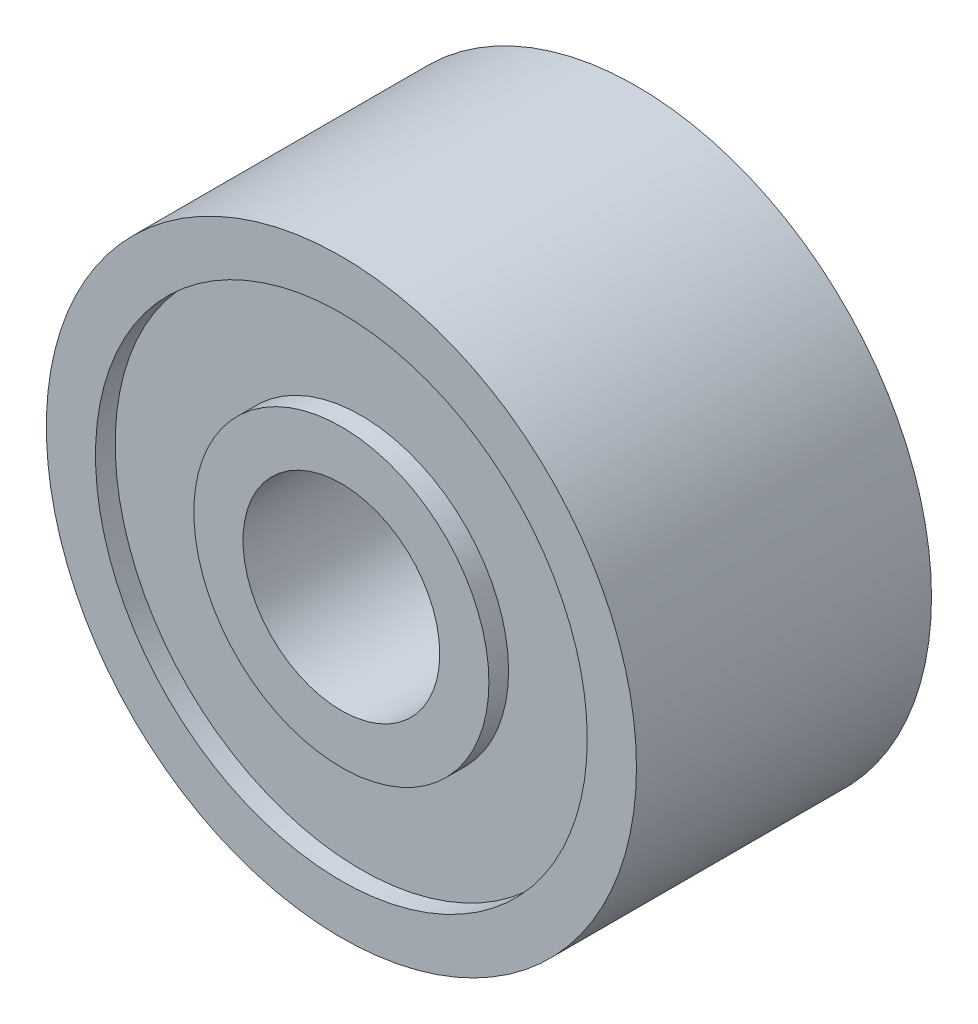
ISO-10303-21;
HEADER;
FILE_DESCRIPTION(('STEP AP214'),'2;1');
FILE_NAME('part.step','',(''),(''),'','','');
FILE_SCHEMA(('AUTOMOTIVE_DESIGN { 1 0 10303 214 1 1 1 1 }'));
ENDSEC;
DATA;
#1=APPLICATION_CONTEXT('core data for automotive mechanical design processes');
#2=APPLICATION_PROTOCOL_DEFINITION('international standard','automotive_design',2000,#1);
#3=PRODUCT_CONTEXT('',#1,'mechanical');
#4=PRODUCT('Part','Part','',(#3));
#5=PRODUCT_RELATED_PRODUCT_CATEGORY('part','',(#4));
#6=PRODUCT_DEFINITION_FORMATION('','',#4);
#7=PRODUCT_DEFINITION_CONTEXT('part definition',#1,'design');
#8=PRODUCT_DEFINITION('design','',#6,#7);
#9=PRODUCT_DEFINITION_SHAPE('','',#8);
#10=(LENGTH_UNIT() NAMED_UNIT(*) SI_UNIT(.MILLI.,.METRE.));
#11=(NAMED_UNIT(*) PLANE_ANGLE_UNIT() SI_UNIT($,.RADIAN.));
#12=(NAMED_UNIT(*) SI_UNIT($,.STERADIAN.) SOLID_ANGLE_UNIT());
#13=UNCERTAINTY_MEASURE_WITH_UNIT(LENGTH_MEASURE(1.E-05),#10,'distance_accuracy_value','');
#14=(GEOMETRIC_REPRESENTATION_CONTEXT(3) GLOBAL_UNCERTAINTY_ASSIGNED_CONTEXT((#13)) GLOBAL_UNIT_ASSIGNED_CONTEXT((#10,
#11,#12)) REPRESENTATION_CONTEXT('',''));
#15=CARTESIAN_POINT('',(0.,0.,0.));
#16=DIRECTION('',(0.,0.,1.));
#17=DIRECTION('',(1.,0.,0.));
#18=AXIS2_PLACEMENT_3D('',#15,#16,#17);
#19=CARTESIAN_POINT('',(0.,0.,-1.5));
#20=DIRECTION('',(0.,0.,1.));
#21=DIRECTION('',(1.,0.,0.));
#22=AXIS2_PLACEMENT_3D('',#19,#20,#21);
#23=PLANE('',#22);
#24=CARTESIAN_POINT('',(0.,0.,-1.5));
#25=DIRECTION('',(0.,0.,1.));
#26=DIRECTION('',(1.,0.,0.));
#27=AXIS2_PLACEMENT_3D('',#24,#25,#26);
#28=CIRCLE('',#27,1.);
#29=CARTESIAN_POINT('',(1.,0.,-1.5));
#30=VERTEX_POINT('',#29);
#31=EDGE_CURVE('E56',#30,#30,#28,.T.);
#32=ORIENTED_EDGE('',*,*,#31,.T.);
#33=EDGE_LOOP('',(#32));
#34=FACE_BOUND('',#33,.T.);
#35=CARTESIAN_POINT('',(0.,0.,-1.5));
#36=DIRECTION('',(0.,0.,1.));
#37=DIRECTION('',(1.,0.,0.));
#38=AXIS2_PLACEMENT_3D('',#35,#36,#37);
#39=CIRCLE('',#38,1.5);
#40=CARTESIAN_POINT('',(1.5,0.,-1.5));
#41=VERTEX_POINT('',#40);
#42=EDGE_CURVE('E88',#41,#41,#39,.T.);
#43=ORIENTED_EDGE('',*,*,#42,.F.);
#44=EDGE_LOOP('',(#43));
#45=FACE_BOUND('',#44,.T.);
#46=ADVANCED_FACE('F41',(#34,#45),#23,.F.);
#47=CARTESIAN_POINT('',(0.,0.,1.5));
#48=DIRECTION('',(0.,0.,1.));
#49=DIRECTION('',(1.,0.,0.));
#50=AXIS2_PLACEMENT_3D('',#47,#48,#49);
#51=PLANE('',#50);
#52=CARTESIAN_POINT('',(0.,0.,1.5));
#53=DIRECTION('',(0.,0.,1.));
#54=DIRECTION('',(1.,0.,0.));
#55=AXIS2_PLACEMENT_3D('',#52,#53,#54);
#56=CIRCLE('',#55,1.);
#57=CARTESIAN_POINT('',(1.,0.,1.5));
#58=VERTEX_POINT('',#57);
#59=EDGE_CURVE('E54',#58,#58,#56,.T.);
#60=ORIENTED_EDGE('',*,*,#59,.F.);
#61=EDGE_LOOP('',(#60));
#62=FACE_BOUND('',#61,.T.);
#63=CARTESIAN_POINT('',(0.,0.,1.5));
#64=DIRECTION('',(0.,0.,1.));
#65=DIRECTION('',(1.,0.,0.));
#66=AXIS2_PLACEMENT_3D('',#63,#64,#65);
#67=CIRCLE('',#66,1.5);
#68=CARTESIAN_POINT('',(1.5,0.,1.5));
#69=VERTEX_POINT('',#68);
#70=EDGE_CURVE('E72',#69,#69,#67,.T.);
#71=ORIENTED_EDGE('',*,*,#70,.T.);
#72=EDGE_LOOP('',(#71));
#73=FACE_BOUND('',#72,.T.);
#74=ADVANCED_FACE('F106',(#62,#73),#51,.T.);
#75=CARTESIAN_POINT('',(0.,0.,1.5));
#76=DIRECTION('',(0.,0.,1.));
#77=DIRECTION('',(1.,0.,0.));
#78=AXIS2_PLACEMENT_3D('',#75,#76,#77);
#79=CIRCLE('',#78,2.5);
#80=CARTESIAN_POINT('',(2.5,0.,1.5));
#81=VERTEX_POINT('',#80);
#82=EDGE_CURVE('E64',#81,#81,#79,.T.);
#83=ORIENTED_EDGE('',*,*,#82,.F.);
#84=EDGE_LOOP('',(#83));
#85=FACE_BOUND('',#84,.T.);
#86=CARTESIAN_POINT('',(0.,0.,1.5));
#87=DIRECTION('',(0.,0.,1.));
#88=DIRECTION('',(1.,0.,0.));
#89=AXIS2_PLACEMENT_3D('',#86,#87,#88);
#90=CIRCLE('',#89,3.);
#91=CARTESIAN_POINT('',(3.,0.,1.5));
#92=VERTEX_POINT('',#91);
#93=EDGE_CURVE('E10',#92,#92,#90,.T.);
#94=ORIENTED_EDGE('',*,*,#93,.T.);
#95=EDGE_LOOP('',(#94));
#96=FACE_BOUND('',#95,.T.);
#97=ADVANCED_FACE('F112',(#85,#96),#51,.T.);
#98=CARTESIAN_POINT('',(0.,0.,-1.5));
#99=DIRECTION('',(0.,0.,1.));
#100=DIRECTION('',(1.,0.,0.));
#101=AXIS2_PLACEMENT_3D('',#98,#99,#100);
#102=CIRCLE('',#101,2.5);
#103=CARTESIAN_POINT('',(2.5,0.,-1.5));
#104=VERTEX_POINT('',#103);
#105=EDGE_CURVE('E80',#104,#104,#102,.T.);
#106=ORIENTED_EDGE('',*,*,#105,.T.);
#107=EDGE_LOOP('',(#106));
#108=FACE_BOUND('',#107,.T.);
#109=CARTESIAN_POINT('',(0.,0.,-1.5));
#110=DIRECTION('',(0.,0.,1.));
#111=DIRECTION('',(1.,0.,0.));
#112=AXIS2_PLACEMENT_3D('',#109,#110,#111);
#113=CIRCLE('',#112,3.);
#114=CARTESIAN_POINT('',(3.,0.,-1.5));
#115=VERTEX_POINT('',#114);
#116=EDGE_CURVE('E45',#115,#115,#113,.T.);
#117=ORIENTED_EDGE('',*,*,#116,.F.);
#118=EDGE_LOOP('',(#117));
#119=FACE_BOUND('',#118,.T.);
#120=ADVANCED_FACE('F108',(#108,#119),#23,.F.);
#121=CARTESIAN_POINT('',(0.,0.,1.5));
#122=DIRECTION('',(0.,0.,-1.));
#123=DIRECTION('',(-1.,0.,0.));
#124=AXIS2_PLACEMENT_3D('',#121,#122,#123);
#125=CYLINDRICAL_SURFACE('',#124,3.);
#126=ORIENTED_EDGE('',*,*,#93,.F.);
#127=EDGE_LOOP('',(#126));
#128=FACE_BOUND('',#127,.T.);
#129=ORIENTED_EDGE('',*,*,#116,.T.);
#130=EDGE_LOOP('',(#129));
#131=FACE_BOUND('',#130,.T.);
#132=ADVANCED_FACE('F43',(#128,#131),#125,.T.);
#133=CARTESIAN_POINT('',(0.,0.,1.5));
#134=DIRECTION('',(0.,0.,-1.));
#135=DIRECTION('',(-1.,0.,0.));
#136=AXIS2_PLACEMENT_3D('',#133,#134,#135);
#137=CYLINDRICAL_SURFACE('',#136,1.);
#138=ORIENTED_EDGE('',*,*,#59,.T.);
#139=EDGE_LOOP('',(#138));
#140=FACE_BOUND('',#139,.T.);
#141=ORIENTED_EDGE('',*,*,#31,.F.);
#142=EDGE_LOOP('',(#141));
#143=FACE_BOUND('',#142,.T.);
#144=ADVANCED_FACE('F121',(#140,#143),#137,.F.);
#145=CARTESIAN_POINT('',(0.,0.,1.3));
#146=DIRECTION('',(0.,0.,1.));
#147=DIRECTION('',(1.,0.,0.));
#148=AXIS2_PLACEMENT_3D('',#145,#146,#147);
#149=CYLINDRICAL_SURFACE('',#148,2.5);
#150=CARTESIAN_POINT('',(0.,0.,1.3));
#151=DIRECTION('',(0.,0.,1.));
#152=DIRECTION('',(1.,0.,0.));
#153=AXIS2_PLACEMENT_3D('',#150,#151,#152);
#154=CIRCLE('',#153,2.5);
#155=CARTESIAN_POINT('',(2.5,0.,1.3));
#156=VERTEX_POINT('',#155);
#157=EDGE_CURVE('E60',#156,#156,#154,.T.);
#158=ORIENTED_EDGE('',*,*,#157,.F.);
#159=EDGE_LOOP('',(#158));
#160=FACE_BOUND('',#159,.T.);
#161=ORIENTED_EDGE('',*,*,#82,.T.);
#162=EDGE_LOOP('',(#161));
#163=FACE_BOUND('',#162,.T.);
#164=ADVANCED_FACE('F145',(#160,#163),#149,.F.);
#165=CARTESIAN_POINT('',(0.,0.,1.3));
#166=DIRECTION('',(0.,0.,1.));
#167=DIRECTION('',(1.,0.,0.));
#168=AXIS2_PLACEMENT_3D('',#165,#166,#167);
#169=PLANE('',#168);
#170=CARTESIAN_POINT('',(0.,0.,1.3));
#171=DIRECTION('',(0.,0.,1.));
#172=DIRECTION('',(1.,0.,0.));
#173=AXIS2_PLACEMENT_3D('',#170,#171,#172);
#174=CIRCLE('',#173,1.5);
#175=CARTESIAN_POINT('',(1.5,0.,1.3));
#176=VERTEX_POINT('',#175);
#177=EDGE_CURVE('E68',#176,#176,#174,.T.);
#178=ORIENTED_EDGE('',*,*,#177,.F.);
#179=EDGE_LOOP('',(#178));
#180=FACE_BOUND('',#179,.T.);
#181=ORIENTED_EDGE('',*,*,#157,.T.);
#182=EDGE_LOOP('',(#181));
#183=FACE_BOUND('',#182,.T.);
#184=ADVANCED_FACE('F141',(#180,#183),#169,.T.);
#185=CARTESIAN_POINT('',(0.,0.,1.3));
#186=DIRECTION('',(0.,0.,1.));
#187=DIRECTION('',(1.,0.,0.));
#188=AXIS2_PLACEMENT_3D('',#185,#186,#187);
#189=CYLINDRICAL_SURFACE('',#188,1.5);
#190=ORIENTED_EDGE('',*,*,#177,.T.);
#191=EDGE_LOOP('',(#190));
#192=FACE_BOUND('',#191,.T.);
#193=ORIENTED_EDGE('',*,*,#70,.F.);
#194=EDGE_LOOP('',(#193));
#195=FACE_BOUND('',#194,.T.);
#196=ADVANCED_FACE('F135',(#192,#195),#189,.T.);
#197=CARTESIAN_POINT('',(0.,0.,-1.3));
#198=DIRECTION('',(0.,0.,1.));
#199=DIRECTION('',(1.,0.,0.));
#200=AXIS2_PLACEMENT_3D('',#197,#198,#199);
#201=PLANE('',#200);
#202=CARTESIAN_POINT('',(0.,0.,-1.3));
#203=DIRECTION('',(0.,0.,1.));
#204=DIRECTION('',(1.,0.,0.));
#205=AXIS2_PLACEMENT_3D('',#202,#203,#204);
#206=CIRCLE('',#205,2.5);
#207=CARTESIAN_POINT('',(2.5,0.,-1.3));
#208=VERTEX_POINT('',#207);
#209=EDGE_CURVE('E76',#208,#208,#206,.T.);
#210=ORIENTED_EDGE('',*,*,#209,.F.);
#211=EDGE_LOOP('',(#210));
#212=FACE_BOUND('',#211,.T.);
#213=CARTESIAN_POINT('',(0.,0.,-1.3));
#214=DIRECTION('',(0.,0.,1.));
#215=DIRECTION('',(1.,0.,0.));
#216=AXIS2_PLACEMENT_3D('',#213,#214,#215);
#217=CIRCLE('',#216,1.5);
#218=CARTESIAN_POINT('',(1.5,0.,-1.3));
#219=VERTEX_POINT('',#218);
#220=EDGE_CURVE('E84',#219,#219,#217,.T.);
#221=ORIENTED_EDGE('',*,*,#220,.T.);
#222=EDGE_LOOP('',(#221));
#223=FACE_BOUND('',#222,.T.);
#224=ADVANCED_FACE('F96',(#212,#223),#201,.F.);
#225=CARTESIAN_POINT('',(0.,0.,-1.3));
#226=DIRECTION('',(0.,0.,-1.));
#227=DIRECTION('',(-1.,0.,0.));
#228=AXIS2_PLACEMENT_3D('',#225,#226,#227);
#229=CYLINDRICAL_SURFACE('',#228,2.5);
#230=ORIENTED_EDGE('',*,*,#209,.T.);
#231=EDGE_LOOP('',(#230));
#232=FACE_BOUND('',#231,.T.);
#233=ORIENTED_EDGE('',*,*,#105,.F.);
#234=EDGE_LOOP('',(#233));
#235=FACE_BOUND('',#234,.T.);
#236=ADVANCED_FACE('F101',(#232,#235),#229,.F.);
#237=CARTESIAN_POINT('',(0.,0.,-1.3));
#238=DIRECTION('',(0.,0.,-1.));
#239=DIRECTION('',(-1.,0.,0.));
#240=AXIS2_PLACEMENT_3D('',#237,#238,#239);
#241=CYLINDRICAL_SURFACE('',#240,1.5);
#242=ORIENTED_EDGE('',*,*,#220,.F.);
#243=EDGE_LOOP('',(#242));
#244=FACE_BOUND('',#243,.T.);
#245=ORIENTED_EDGE('',*,*,#42,.T.);
#246=EDGE_LOOP('',(#245));
#247=FACE_BOUND('',#246,.T.);
#248=ADVANCED_FACE('F98',(#244,#247),#241,.T.);
#249=CLOSED_SHELL('',(#46,#74,#97,#120,#132,#144,#164,#184,#196,#224,#236,#248));
#250=MANIFOLD_SOLID_BREP('B2',#249);
#251=ADVANCED_BREP_SHAPE_REPRESENTATION('',(#18,#250),#14);
#252=SHAPE_DEFINITION_REPRESENTATION(#9,#251);
ENDSEC;
END-ISO-10303-21;
